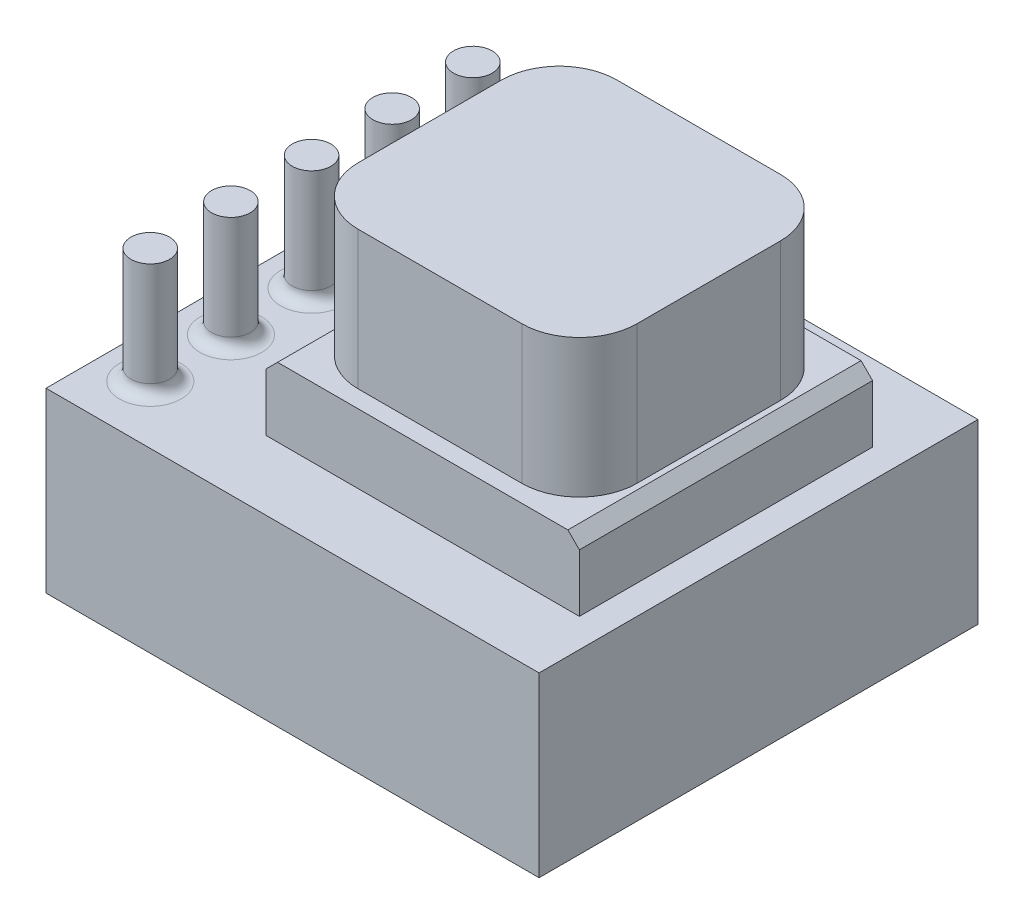
ISO-10303-21;
HEADER;
FILE_DESCRIPTION(('STEP AP214'),'2;1');
FILE_NAME('part.step','',(''),(''),'','','');
FILE_SCHEMA(('AUTOMOTIVE_DESIGN { 1 0 10303 214 1 1 1 1 }'));
ENDSEC;
DATA;
#1=APPLICATION_CONTEXT('core data for automotive mechanical design processes');
#2=APPLICATION_PROTOCOL_DEFINITION('international standard','automotive_design',2000,#1);
#3=PRODUCT_CONTEXT('',#1,'mechanical');
#4=PRODUCT('Part','Part','',(#3));
#5=PRODUCT_RELATED_PRODUCT_CATEGORY('part','',(#4));
#6=PRODUCT_DEFINITION_FORMATION('','',#4);
#7=PRODUCT_DEFINITION_CONTEXT('part definition',#1,'design');
#8=PRODUCT_DEFINITION('design','',#6,#7);
#9=PRODUCT_DEFINITION_SHAPE('','',#8);
#10=(LENGTH_UNIT() NAMED_UNIT(*) SI_UNIT(.MILLI.,.METRE.));
#11=(NAMED_UNIT(*) PLANE_ANGLE_UNIT() SI_UNIT($,.RADIAN.));
#12=(NAMED_UNIT(*) SI_UNIT($,.STERADIAN.) SOLID_ANGLE_UNIT());
#13=UNCERTAINTY_MEASURE_WITH_UNIT(LENGTH_MEASURE(1.E-05),#10,'distance_accuracy_value','');
#14=(GEOMETRIC_REPRESENTATION_CONTEXT(3) GLOBAL_UNCERTAINTY_ASSIGNED_CONTEXT((#13)) GLOBAL_UNIT_ASSIGNED_CONTEXT((#10,
#11,#12)) REPRESENTATION_CONTEXT('',''));
#15=CARTESIAN_POINT('',(0.,0.,0.));
#16=DIRECTION('',(0.,0.,1.));
#17=DIRECTION('',(1.,0.,0.));
#18=AXIS2_PLACEMENT_3D('',#15,#16,#17);
#19=CARTESIAN_POINT('',(0.,33.4,0.));
#20=DIRECTION('',(0.,-1.,0.));
#21=DIRECTION('',(0.,0.,-1.));
#22=AXIS2_PLACEMENT_3D('',#19,#20,#21);
#23=PLANE('',#22);
#24=CARTESIAN_POINT('',(19.6,33.4,-24.95));
#25=DIRECTION('',(0.,1.,0.));
#26=DIRECTION('',(0.,0.,1.));
#27=AXIS2_PLACEMENT_3D('',#24,#25,#26);
#28=CIRCLE('',#27,5.);
#29=CARTESIAN_POINT('',(14.6,33.4,-24.95));
#30=VERTEX_POINT('',#29);
#31=CARTESIAN_POINT('',(19.6,33.4,-29.95));
#32=VERTEX_POINT('',#31);
#33=EDGE_CURVE('E177',#30,#32,#28,.F.);
#34=ORIENTED_EDGE('',*,*,#33,.F.);
#35=DIRECTION('',(0.,0.,1.));
#36=VECTOR('',#35,1.);
#37=CARTESIAN_POINT('',(14.6,33.4,-29.95));
#38=LINE('',#37,#36);
#39=CARTESIAN_POINT('',(14.6,33.4,-12.5));
#40=VERTEX_POINT('',#39);
#41=EDGE_CURVE('E172',#40,#30,#38,.F.);
#42=ORIENTED_EDGE('',*,*,#41,.F.);
#43=CARTESIAN_POINT('',(19.6,33.4,-12.5));
#44=DIRECTION('',(0.,1.,0.));
#45=DIRECTION('',(0.,0.,1.));
#46=AXIS2_PLACEMENT_3D('',#43,#44,#45);
#47=CIRCLE('',#46,5.);
#48=CARTESIAN_POINT('',(19.6,33.4,-7.5));
#49=VERTEX_POINT('',#48);
#50=EDGE_CURVE('E245',#49,#40,#47,.F.);
#51=ORIENTED_EDGE('',*,*,#50,.F.);
#52=DIRECTION('',(1.,0.,0.));
#53=VECTOR('',#52,1.);
#54=CARTESIAN_POINT('',(14.6,33.4,-7.5));
#55=LINE('',#54,#53);
#56=CARTESIAN_POINT('',(33.8,33.4,-7.5));
#57=VERTEX_POINT('',#56);
#58=EDGE_CURVE('E205',#57,#49,#55,.F.);
#59=ORIENTED_EDGE('',*,*,#58,.F.);
#60=CARTESIAN_POINT('',(33.8,33.4,-12.5));
#61=DIRECTION('',(0.,1.,0.));
#62=DIRECTION('',(0.,0.,1.));
#63=AXIS2_PLACEMENT_3D('',#60,#61,#62);
#64=CIRCLE('',#63,5.);
#65=CARTESIAN_POINT('',(38.8,33.4,-12.5));
#66=VERTEX_POINT('',#65);
#67=EDGE_CURVE('E248',#66,#57,#64,.F.);
#68=ORIENTED_EDGE('',*,*,#67,.F.);
#69=DIRECTION('',(0.,0.,-1.));
#70=VECTOR('',#69,1.);
#71=CARTESIAN_POINT('',(38.8,33.4,-7.5));
#72=LINE('',#71,#70);
#73=CARTESIAN_POINT('',(38.8,33.4,-24.95));
#74=VERTEX_POINT('',#73);
#75=EDGE_CURVE('E209',#74,#66,#72,.F.);
#76=ORIENTED_EDGE('',*,*,#75,.F.);
#77=CARTESIAN_POINT('',(33.8,33.4,-24.95));
#78=DIRECTION('',(0.,1.,0.));
#79=DIRECTION('',(0.,0.,1.));
#80=AXIS2_PLACEMENT_3D('',#77,#78,#79);
#81=CIRCLE('',#80,5.);
#82=CARTESIAN_POINT('',(33.8,33.4,-29.95));
#83=VERTEX_POINT('',#82);
#84=EDGE_CURVE('E190',#83,#74,#81,.F.);
#85=ORIENTED_EDGE('',*,*,#84,.F.);
#86=DIRECTION('',(-1.,0.,0.));
#87=VECTOR('',#86,1.);
#88=CARTESIAN_POINT('',(38.8,33.4,-29.95));
#89=LINE('',#88,#87);
#90=EDGE_CURVE('E188',#32,#83,#89,.F.);
#91=ORIENTED_EDGE('',*,*,#90,.F.);
#92=EDGE_LOOP('',(#34,#42,#51,#59,#68,#76,#85,#91));
#93=FACE_BOUND('',#92,.T.);
#94=ADVANCED_FACE('F18',(#93),#23,.F.);
#95=CARTESIAN_POINT('',(4.,25.4,-5.05));
#96=DIRECTION('',(0.,1.,0.));
#97=DIRECTION('',(0.,0.,1.));
#98=AXIS2_PLACEMENT_3D('',#95,#96,#97);
#99=PLANE('',#98);
#100=CARTESIAN_POINT('',(4.,25.4,-5.05));
#101=DIRECTION('',(0.,-1.,0.));
#102=DIRECTION('',(0.,0.,-1.));
#103=AXIS2_PLACEMENT_3D('',#100,#101,#102);
#104=CIRCLE('',#103,1.675);
#105=CARTESIAN_POINT('',(4.,25.4,-6.725));
#106=VERTEX_POINT('',#105);
#107=EDGE_CURVE('E241',#106,#106,#104,.T.);
#108=ORIENTED_EDGE('',*,*,#107,.F.);
#109=EDGE_LOOP('',(#108));
#110=FACE_BOUND('',#109,.T.);
#111=ADVANCED_FACE('F829',(#110),#99,.T.);
#112=CARTESIAN_POINT('',(4.,25.4,-12.05));
#113=DIRECTION('',(0.,1.,0.));
#114=DIRECTION('',(0.,0.,1.));
#115=AXIS2_PLACEMENT_3D('',#112,#113,#114);
#116=PLANE('',#115);
#117=CARTESIAN_POINT('',(4.,25.4,-12.05));
#118=DIRECTION('',(0.,-1.,0.));
#119=DIRECTION('',(0.,0.,-1.));
#120=AXIS2_PLACEMENT_3D('',#117,#118,#119);
#121=CIRCLE('',#120,1.675);
#122=CARTESIAN_POINT('',(4.,25.4,-13.725));
#123=VERTEX_POINT('',#122);
#124=EDGE_CURVE('E238',#123,#123,#121,.T.);
#125=ORIENTED_EDGE('',*,*,#124,.F.);
#126=EDGE_LOOP('',(#125));
#127=FACE_BOUND('',#126,.T.);
#128=ADVANCED_FACE('F594',(#127),#116,.T.);
#129=CARTESIAN_POINT('',(4.,25.4,-19.05));
#130=DIRECTION('',(0.,1.,0.));
#131=DIRECTION('',(0.,0.,1.));
#132=AXIS2_PLACEMENT_3D('',#129,#130,#131);
#133=PLANE('',#132);
#134=CARTESIAN_POINT('',(4.,25.4,-19.05));
#135=DIRECTION('',(0.,-1.,0.));
#136=DIRECTION('',(0.,0.,-1.));
#137=AXIS2_PLACEMENT_3D('',#134,#135,#136);
#138=CIRCLE('',#137,1.675);
#139=CARTESIAN_POINT('',(4.,25.4,-20.725));
#140=VERTEX_POINT('',#139);
#141=EDGE_CURVE('E235',#140,#140,#138,.T.);
#142=ORIENTED_EDGE('',*,*,#141,.F.);
#143=EDGE_LOOP('',(#142));
#144=FACE_BOUND('',#143,.T.);
#145=ADVANCED_FACE('F584',(#144),#133,.T.);
#146=CARTESIAN_POINT('',(4.,25.4,-26.05));
#147=DIRECTION('',(0.,1.,0.));
#148=DIRECTION('',(0.,0.,1.));
#149=AXIS2_PLACEMENT_3D('',#146,#147,#148);
#150=PLANE('',#149);
#151=CARTESIAN_POINT('',(4.,25.4,-26.05));
#152=DIRECTION('',(0.,-1.,0.));
#153=DIRECTION('',(0.,0.,-1.));
#154=AXIS2_PLACEMENT_3D('',#151,#152,#153);
#155=CIRCLE('',#154,1.675);
#156=CARTESIAN_POINT('',(4.,25.4,-27.725));
#157=VERTEX_POINT('',#156);
#158=EDGE_CURVE('E232',#157,#157,#155,.T.);
#159=ORIENTED_EDGE('',*,*,#158,.F.);
#160=EDGE_LOOP('',(#159));
#161=FACE_BOUND('',#160,.T.);
#162=ADVANCED_FACE('F581',(#161),#150,.T.);
#163=CARTESIAN_POINT('',(4.,25.4,-33.05));
#164=DIRECTION('',(0.,1.,0.));
#165=DIRECTION('',(0.,0.,1.));
#166=AXIS2_PLACEMENT_3D('',#163,#164,#165);
#167=PLANE('',#166);
#168=CARTESIAN_POINT('',(4.,25.4,-33.05));
#169=DIRECTION('',(0.,-1.,0.));
#170=DIRECTION('',(0.,0.,-1.));
#171=AXIS2_PLACEMENT_3D('',#168,#169,#170);
#172=CIRCLE('',#171,1.675);
#173=CARTESIAN_POINT('',(4.,25.4,-34.725));
#174=VERTEX_POINT('',#173);
#175=EDGE_CURVE('E228',#174,#174,#172,.T.);
#176=ORIENTED_EDGE('',*,*,#175,.F.);
#177=EDGE_LOOP('',(#176));
#178=FACE_BOUND('',#177,.T.);
#179=ADVANCED_FACE('F583',(#178),#167,.T.);
#180=CARTESIAN_POINT('',(14.6,21.4,-29.95));
#181=DIRECTION('',(-1.,0.,0.));
#182=DIRECTION('',(0.,0.,1.));
#183=AXIS2_PLACEMENT_3D('',#180,#181,#182);
#184=PLANE('',#183);
#185=DIRECTION('',(0.,0.,1.));
#186=VECTOR('',#185,1.);
#187=CARTESIAN_POINT('',(14.6,21.4,-19.05));
#188=LINE('',#187,#186);
#189=CARTESIAN_POINT('',(14.6,21.4,-12.5));
#190=VERTEX_POINT('',#189);
#191=CARTESIAN_POINT('',(14.6,21.4,-24.95));
#192=VERTEX_POINT('',#191);
#193=EDGE_CURVE('E227',#190,#192,#188,.F.);
#194=ORIENTED_EDGE('',*,*,#193,.F.);
#195=DIRECTION('',(0.,1.,0.));
#196=VECTOR('',#195,1.);
#197=CARTESIAN_POINT('',(14.6,21.4,-12.5));
#198=LINE('',#197,#196);
#199=EDGE_CURVE('E244',#40,#190,#198,.F.);
#200=ORIENTED_EDGE('',*,*,#199,.F.);
#201=ORIENTED_EDGE('',*,*,#41,.T.);
#202=DIRECTION('',(0.,1.,0.));
#203=VECTOR('',#202,1.);
#204=CARTESIAN_POINT('',(14.6,21.4,-24.95));
#205=LINE('',#204,#203);
#206=EDGE_CURVE('E184',#192,#30,#205,.T.);
#207=ORIENTED_EDGE('',*,*,#206,.F.);
#208=EDGE_LOOP('',(#194,#200,#201,#207));
#209=FACE_BOUND('',#208,.T.);
#210=ADVANCED_FACE('F591',(#209),#184,.T.);
#211=CARTESIAN_POINT('',(19.6,21.4,-24.95));
#212=DIRECTION('',(0.,1.,0.));
#213=DIRECTION('',(0.,0.,1.));
#214=AXIS2_PLACEMENT_3D('',#211,#212,#213);
#215=CYLINDRICAL_SURFACE('',#214,5.);
#216=ORIENTED_EDGE('',*,*,#33,.T.);
#217=DIRECTION('',(0.,1.,0.));
#218=VECTOR('',#217,1.);
#219=CARTESIAN_POINT('',(19.6,21.4,-29.95));
#220=LINE('',#219,#218);
#221=CARTESIAN_POINT('',(19.6,21.4,-29.95));
#222=VERTEX_POINT('',#221);
#223=EDGE_CURVE('E182',#222,#32,#220,.T.);
#224=ORIENTED_EDGE('',*,*,#223,.F.);
#225=CARTESIAN_POINT('',(19.6,21.4,-24.95));
#226=DIRECTION('',(0.,1.,0.));
#227=DIRECTION('',(0.,0.,1.));
#228=AXIS2_PLACEMENT_3D('',#225,#226,#227);
#229=CIRCLE('',#228,5.);
#230=EDGE_CURVE('E225',#192,#222,#229,.F.);
#231=ORIENTED_EDGE('',*,*,#230,.F.);
#232=ORIENTED_EDGE('',*,*,#206,.T.);
#233=EDGE_LOOP('',(#216,#224,#231,#232));
#234=FACE_BOUND('',#233,.T.);
#235=ADVANCED_FACE('F179',(#234),#215,.T.);
#236=CARTESIAN_POINT('',(38.8,21.4,-29.95));
#237=DIRECTION('',(0.,0.,-1.));
#238=DIRECTION('',(-1.,0.,0.));
#239=AXIS2_PLACEMENT_3D('',#236,#237,#238);
#240=PLANE('',#239);
#241=ORIENTED_EDGE('',*,*,#90,.T.);
#242=DIRECTION('',(0.,1.,0.));
#243=VECTOR('',#242,1.);
#244=CARTESIAN_POINT('',(33.8,21.4,-29.95));
#245=LINE('',#244,#243);
#246=CARTESIAN_POINT('',(33.8,21.4,-29.95));
#247=VERTEX_POINT('',#246);
#248=EDGE_CURVE('E193',#247,#83,#245,.T.);
#249=ORIENTED_EDGE('',*,*,#248,.F.);
#250=DIRECTION('',(1.,0.,0.));
#251=VECTOR('',#250,1.);
#252=CARTESIAN_POINT('',(21.4,21.4,-29.95));
#253=LINE('',#252,#251);
#254=EDGE_CURVE('E197',#222,#247,#253,.T.);
#255=ORIENTED_EDGE('',*,*,#254,.F.);
#256=ORIENTED_EDGE('',*,*,#223,.T.);
#257=EDGE_LOOP('',(#241,#249,#255,#256));
#258=FACE_BOUND('',#257,.T.);
#259=ADVANCED_FACE('F195',(#258),#240,.T.);
#260=CARTESIAN_POINT('',(33.8,21.4,-24.95));
#261=DIRECTION('',(0.,1.,0.));
#262=DIRECTION('',(0.,0.,1.));
#263=AXIS2_PLACEMENT_3D('',#260,#261,#262);
#264=CYLINDRICAL_SURFACE('',#263,5.);
#265=ORIENTED_EDGE('',*,*,#84,.T.);
#266=DIRECTION('',(0.,1.,0.));
#267=VECTOR('',#266,1.);
#268=CARTESIAN_POINT('',(38.8,21.4,-24.95));
#269=LINE('',#268,#267);
#270=CARTESIAN_POINT('',(38.8,21.4,-24.95));
#271=VERTEX_POINT('',#270);
#272=EDGE_CURVE('E211',#271,#74,#269,.T.);
#273=ORIENTED_EDGE('',*,*,#272,.F.);
#274=CARTESIAN_POINT('',(33.8,21.4,-24.95));
#275=DIRECTION('',(0.,1.,0.));
#276=DIRECTION('',(0.,0.,1.));
#277=AXIS2_PLACEMENT_3D('',#274,#275,#276);
#278=CIRCLE('',#277,5.);
#279=EDGE_CURVE('E222',#247,#271,#278,.F.);
#280=ORIENTED_EDGE('',*,*,#279,.F.);
#281=ORIENTED_EDGE('',*,*,#248,.T.);
#282=EDGE_LOOP('',(#265,#273,#280,#281));
#283=FACE_BOUND('',#282,.T.);
#284=ADVANCED_FACE('F507',(#283),#264,.T.);
#285=CARTESIAN_POINT('',(38.8,21.4,-7.5));
#286=DIRECTION('',(1.,0.,0.));
#287=DIRECTION('',(0.,0.,-1.));
#288=AXIS2_PLACEMENT_3D('',#285,#286,#287);
#289=PLANE('',#288);
#290=ORIENTED_EDGE('',*,*,#75,.T.);
#291=DIRECTION('',(0.,1.,0.));
#292=VECTOR('',#291,1.);
#293=CARTESIAN_POINT('',(38.8,21.4,-12.5));
#294=LINE('',#293,#292);
#295=CARTESIAN_POINT('',(38.8,21.4,-12.5));
#296=VERTEX_POINT('',#295);
#297=EDGE_CURVE('E210',#296,#66,#294,.T.);
#298=ORIENTED_EDGE('',*,*,#297,.F.);
#299=DIRECTION('',(0.,0.,1.));
#300=VECTOR('',#299,1.);
#301=CARTESIAN_POINT('',(38.8,21.4,-19.05));
#302=LINE('',#301,#300);
#303=EDGE_CURVE('E221',#271,#296,#302,.T.);
#304=ORIENTED_EDGE('',*,*,#303,.F.);
#305=ORIENTED_EDGE('',*,*,#272,.T.);
#306=EDGE_LOOP('',(#290,#298,#304,#305));
#307=FACE_BOUND('',#306,.T.);
#308=ADVANCED_FACE('F502',(#307),#289,.T.);
#309=CARTESIAN_POINT('',(33.8,21.4,-12.5));
#310=DIRECTION('',(0.,1.,0.));
#311=DIRECTION('',(0.,0.,1.));
#312=AXIS2_PLACEMENT_3D('',#309,#310,#311);
#313=CYLINDRICAL_SURFACE('',#312,5.);
#314=ORIENTED_EDGE('',*,*,#67,.T.);
#315=DIRECTION('',(0.,1.,0.));
#316=VECTOR('',#315,1.);
#317=CARTESIAN_POINT('',(33.8,21.4,-7.5));
#318=LINE('',#317,#316);
#319=CARTESIAN_POINT('',(33.8,21.4,-7.5));
#320=VERTEX_POINT('',#319);
#321=EDGE_CURVE('E208',#320,#57,#318,.T.);
#322=ORIENTED_EDGE('',*,*,#321,.F.);
#323=CARTESIAN_POINT('',(33.8,21.4,-12.5));
#324=DIRECTION('',(0.,1.,0.));
#325=DIRECTION('',(0.,0.,1.));
#326=AXIS2_PLACEMENT_3D('',#323,#324,#325);
#327=CIRCLE('',#326,5.);
#328=EDGE_CURVE('E218',#296,#320,#327,.F.);
#329=ORIENTED_EDGE('',*,*,#328,.F.);
#330=ORIENTED_EDGE('',*,*,#297,.T.);
#331=EDGE_LOOP('',(#314,#322,#329,#330));
#332=FACE_BOUND('',#331,.T.);
#333=ADVANCED_FACE('F512',(#332),#313,.T.);
#334=CARTESIAN_POINT('',(14.6,21.4,-7.5));
#335=DIRECTION('',(0.,0.,1.));
#336=DIRECTION('',(1.,0.,0.));
#337=AXIS2_PLACEMENT_3D('',#334,#335,#336);
#338=PLANE('',#337);
#339=ORIENTED_EDGE('',*,*,#58,.T.);
#340=DIRECTION('',(0.,1.,0.));
#341=VECTOR('',#340,1.);
#342=CARTESIAN_POINT('',(19.6,21.4,-7.5));
#343=LINE('',#342,#341);
#344=CARTESIAN_POINT('',(19.6,21.4,-7.5));
#345=VERTEX_POINT('',#344);
#346=EDGE_CURVE('E207',#345,#49,#343,.T.);
#347=ORIENTED_EDGE('',*,*,#346,.F.);
#348=DIRECTION('',(1.,0.,0.));
#349=VECTOR('',#348,1.);
#350=CARTESIAN_POINT('',(21.4,21.4,-7.5));
#351=LINE('',#350,#349);
#352=EDGE_CURVE('E217',#320,#345,#351,.F.);
#353=ORIENTED_EDGE('',*,*,#352,.F.);
#354=ORIENTED_EDGE('',*,*,#321,.T.);
#355=EDGE_LOOP('',(#339,#347,#353,#354));
#356=FACE_BOUND('',#355,.T.);
#357=ADVANCED_FACE('F757',(#356),#338,.T.);
#358=CARTESIAN_POINT('',(19.6,21.4,-12.5));
#359=DIRECTION('',(0.,1.,0.));
#360=DIRECTION('',(0.,0.,1.));
#361=AXIS2_PLACEMENT_3D('',#358,#359,#360);
#362=CYLINDRICAL_SURFACE('',#361,5.);
#363=ORIENTED_EDGE('',*,*,#50,.T.);
#364=ORIENTED_EDGE('',*,*,#199,.T.);
#365=CARTESIAN_POINT('',(19.6,21.4,-12.5));
#366=DIRECTION('',(0.,1.,0.));
#367=DIRECTION('',(0.,0.,1.));
#368=AXIS2_PLACEMENT_3D('',#365,#366,#367);
#369=CIRCLE('',#368,5.);
#370=EDGE_CURVE('E213',#345,#190,#369,.F.);
#371=ORIENTED_EDGE('',*,*,#370,.F.);
#372=ORIENTED_EDGE('',*,*,#346,.T.);
#373=EDGE_LOOP('',(#363,#364,#371,#372));
#374=FACE_BOUND('',#373,.T.);
#375=ADVANCED_FACE('F749',(#374),#362,.T.);
#376=CARTESIAN_POINT('',(4.,25.4,-5.05));
#377=DIRECTION('',(0.,-1.,0.));
#378=DIRECTION('',(0.,0.,-1.));
#379=AXIS2_PLACEMENT_3D('',#376,#377,#378);
#380=CYLINDRICAL_SURFACE('',#379,1.675);
#381=CARTESIAN_POINT('',(4.,16.4,-5.05));
#382=DIRECTION('',(0.,-1.,0.));
#383=DIRECTION('',(0.,0.,-1.));
#384=AXIS2_PLACEMENT_3D('',#381,#382,#383);
#385=CIRCLE('',#384,1.675);
#386=CARTESIAN_POINT('',(4.,16.4,-6.725));
#387=VERTEX_POINT('',#386);
#388=EDGE_CURVE('E488',#387,#387,#385,.F.);
#389=ORIENTED_EDGE('',*,*,#388,.T.);
#390=EDGE_LOOP('',(#389));
#391=FACE_BOUND('',#390,.T.);
#392=ORIENTED_EDGE('',*,*,#107,.T.);
#393=EDGE_LOOP('',(#392));
#394=FACE_BOUND('',#393,.T.);
#395=ADVANCED_FACE('F741',(#391,#394),#380,.T.);
#396=CARTESIAN_POINT('',(4.,25.4,-12.05));
#397=DIRECTION('',(0.,-1.,0.));
#398=DIRECTION('',(0.,0.,-1.));
#399=AXIS2_PLACEMENT_3D('',#396,#397,#398);
#400=CYLINDRICAL_SURFACE('',#399,1.675);
#401=CARTESIAN_POINT('',(4.,16.4,-12.05));
#402=DIRECTION('',(0.,-1.,0.));
#403=DIRECTION('',(0.,0.,-1.));
#404=AXIS2_PLACEMENT_3D('',#401,#402,#403);
#405=CIRCLE('',#404,1.675);
#406=CARTESIAN_POINT('',(4.,16.4,-13.725));
#407=VERTEX_POINT('',#406);
#408=EDGE_CURVE('E485',#407,#407,#405,.F.);
#409=ORIENTED_EDGE('',*,*,#408,.T.);
#410=EDGE_LOOP('',(#409));
#411=FACE_BOUND('',#410,.T.);
#412=ORIENTED_EDGE('',*,*,#124,.T.);
#413=EDGE_LOOP('',(#412));
#414=FACE_BOUND('',#413,.T.);
#415=ADVANCED_FACE('F733',(#411,#414),#400,.T.);
#416=CARTESIAN_POINT('',(4.,25.4,-19.05));
#417=DIRECTION('',(0.,-1.,0.));
#418=DIRECTION('',(0.,0.,-1.));
#419=AXIS2_PLACEMENT_3D('',#416,#417,#418);
#420=CYLINDRICAL_SURFACE('',#419,1.675);
#421=CARTESIAN_POINT('',(4.,16.4,-19.05));
#422=DIRECTION('',(0.,-1.,0.));
#423=DIRECTION('',(0.,0.,-1.));
#424=AXIS2_PLACEMENT_3D('',#421,#422,#423);
#425=CIRCLE('',#424,1.675);
#426=CARTESIAN_POINT('',(4.,16.4,-20.725));
#427=VERTEX_POINT('',#426);
#428=EDGE_CURVE('E478',#427,#427,#425,.F.);
#429=ORIENTED_EDGE('',*,*,#428,.T.);
#430=EDGE_LOOP('',(#429));
#431=FACE_BOUND('',#430,.T.);
#432=ORIENTED_EDGE('',*,*,#141,.T.);
#433=EDGE_LOOP('',(#432));
#434=FACE_BOUND('',#433,.T.);
#435=ADVANCED_FACE('F577',(#431,#434),#420,.T.);
#436=CARTESIAN_POINT('',(4.,25.4,-26.05));
#437=DIRECTION('',(0.,-1.,0.));
#438=DIRECTION('',(0.,0.,-1.));
#439=AXIS2_PLACEMENT_3D('',#436,#437,#438);
#440=CYLINDRICAL_SURFACE('',#439,1.675);
#441=CARTESIAN_POINT('',(4.,16.4,-26.05));
#442=DIRECTION('',(0.,-1.,0.));
#443=DIRECTION('',(0.,0.,-1.));
#444=AXIS2_PLACEMENT_3D('',#441,#442,#443);
#445=CIRCLE('',#444,1.675);
#446=CARTESIAN_POINT('',(4.,16.4,-27.725));
#447=VERTEX_POINT('',#446);
#448=EDGE_CURVE('E473',#447,#447,#445,.F.);
#449=ORIENTED_EDGE('',*,*,#448,.T.);
#450=EDGE_LOOP('',(#449));
#451=FACE_BOUND('',#450,.T.);
#452=ORIENTED_EDGE('',*,*,#158,.T.);
#453=EDGE_LOOP('',(#452));
#454=FACE_BOUND('',#453,.T.);
#455=ADVANCED_FACE('F573',(#451,#454),#440,.T.);
#456=CARTESIAN_POINT('',(4.,25.4,-33.05));
#457=DIRECTION('',(0.,-1.,0.));
#458=DIRECTION('',(0.,0.,-1.));
#459=AXIS2_PLACEMENT_3D('',#456,#457,#458);
#460=CYLINDRICAL_SURFACE('',#459,1.675);
#461=CARTESIAN_POINT('',(4.,16.4,-33.05));
#462=DIRECTION('',(0.,-1.,0.));
#463=DIRECTION('',(0.,0.,-1.));
#464=AXIS2_PLACEMENT_3D('',#461,#462,#463);
#465=CIRCLE('',#464,1.675);
#466=CARTESIAN_POINT('',(4.,16.4,-34.725));
#467=VERTEX_POINT('',#466);
#468=EDGE_CURVE('E469',#467,#467,#465,.F.);
#469=ORIENTED_EDGE('',*,*,#468,.T.);
#470=EDGE_LOOP('',(#469));
#471=FACE_BOUND('',#470,.T.);
#472=ORIENTED_EDGE('',*,*,#175,.T.);
#473=EDGE_LOOP('',(#472));
#474=FACE_BOUND('',#473,.T.);
#475=ADVANCED_FACE('F576',(#471,#474),#460,.T.);
#476=CARTESIAN_POINT('',(14.1,21.4,-19.05));
#477=DIRECTION('',(-0.707106781186548,0.707106781186547,0.));
#478=DIRECTION('',(-0.707106781186547,-0.707106781186548,0.));
#479=AXIS2_PLACEMENT_3D('',#476,#477,#478);
#480=PLANE('',#479);
#481=DIRECTION('',(-0.707106781186547,-0.707106781186548,0.));
#482=VECTOR('',#481,1.);
#483=CARTESIAN_POINT('',(14.1,21.4,-5.99999999999999));
#484=LINE('',#483,#482);
#485=CARTESIAN_POINT('',(13.1,20.4,-6.));
#486=VERTEX_POINT('',#485);
#487=CARTESIAN_POINT('',(14.1,21.4,-6.));
#488=VERTEX_POINT('',#487);
#489=EDGE_CURVE('E231',#486,#488,#484,.F.);
#490=ORIENTED_EDGE('',*,*,#489,.T.);
#491=DIRECTION('',(0.,0.,1.));
#492=VECTOR('',#491,1.);
#493=CARTESIAN_POINT('',(14.1,21.4,-19.05));
#494=LINE('',#493,#492);
#495=CARTESIAN_POINT('',(14.1,21.4,-31.45));
#496=VERTEX_POINT('',#495);
#497=EDGE_CURVE('E216',#496,#488,#494,.T.);
#498=ORIENTED_EDGE('',*,*,#497,.F.);
#499=DIRECTION('',(-0.707106781186545,-0.70710678118655,0.));
#500=VECTOR('',#499,1.);
#501=CARTESIAN_POINT('',(14.1,21.4,-31.45));
#502=LINE('',#501,#500);
#503=CARTESIAN_POINT('',(13.1,20.4,-31.45));
#504=VERTEX_POINT('',#503);
#505=EDGE_CURVE('E461',#496,#504,#502,.T.);
#506=ORIENTED_EDGE('',*,*,#505,.T.);
#507=DIRECTION('',(0.,0.,-1.));
#508=VECTOR('',#507,1.);
#509=CARTESIAN_POINT('',(13.1,20.4,-31.45));
#510=LINE('',#509,#508);
#511=EDGE_CURVE('E455',#504,#486,#510,.F.);
#512=ORIENTED_EDGE('',*,*,#511,.T.);
#513=EDGE_LOOP('',(#490,#498,#506,#512));
#514=FACE_BOUND('',#513,.T.);
#515=ADVANCED_FACE('F523',(#514),#480,.T.);
#516=CARTESIAN_POINT('',(21.4,21.4,-19.05));
#517=DIRECTION('',(0.,1.,0.));
#518=DIRECTION('',(0.,0.,1.));
#519=AXIS2_PLACEMENT_3D('',#516,#517,#518);
#520=PLANE('',#519);
#521=DIRECTION('',(-1.,0.,0.));
#522=VECTOR('',#521,1.);
#523=CARTESIAN_POINT('',(40.3,21.4,-6.));
#524=LINE('',#523,#522);
#525=CARTESIAN_POINT('',(39.3,21.4,-5.99999999999999));
#526=VERTEX_POINT('',#525);
#527=EDGE_CURVE('E447',#488,#526,#524,.F.);
#528=ORIENTED_EDGE('',*,*,#527,.T.);
#529=DIRECTION('',(0.,0.,1.));
#530=VECTOR('',#529,1.);
#531=CARTESIAN_POINT('',(39.3,21.4,-19.05));
#532=LINE('',#531,#530);
#533=CARTESIAN_POINT('',(39.3,21.4,-31.45));
#534=VERTEX_POINT('',#533);
#535=EDGE_CURVE('E491',#534,#526,#532,.T.);
#536=ORIENTED_EDGE('',*,*,#535,.F.);
#537=DIRECTION('',(1.,0.,0.));
#538=VECTOR('',#537,1.);
#539=CARTESIAN_POINT('',(40.3,21.4,-31.45));
#540=LINE('',#539,#538);
#541=EDGE_CURVE('E462',#534,#496,#540,.F.);
#542=ORIENTED_EDGE('',*,*,#541,.T.);
#543=ORIENTED_EDGE('',*,*,#497,.T.);
#544=EDGE_LOOP('',(#528,#536,#542,#543));
#545=FACE_BOUND('',#544,.T.);
#546=ORIENTED_EDGE('',*,*,#352,.T.);
#547=ORIENTED_EDGE('',*,*,#370,.T.);
#548=ORIENTED_EDGE('',*,*,#193,.T.);
#549=ORIENTED_EDGE('',*,*,#230,.T.);
#550=ORIENTED_EDGE('',*,*,#254,.T.);
#551=ORIENTED_EDGE('',*,*,#279,.T.);
#552=ORIENTED_EDGE('',*,*,#303,.T.);
#553=ORIENTED_EDGE('',*,*,#328,.T.);
#554=EDGE_LOOP('',(#546,#547,#548,#549,#550,#551,#552,#553));
#555=FACE_BOUND('',#554,.T.);
#556=ADVANCED_FACE('F516',(#545,#555),#520,.T.);
#557=CARTESIAN_POINT('',(39.3,21.4,-19.05));
#558=DIRECTION('',(0.70710678118655,0.707106781186545,0.));
#559=DIRECTION('',(-0.707106781186545,0.70710678118655,0.));
#560=AXIS2_PLACEMENT_3D('',#557,#558,#559);
#561=PLANE('',#560);
#562=DIRECTION('',(-0.707106781186545,0.70710678118655,0.));
#563=VECTOR('',#562,1.);
#564=CARTESIAN_POINT('',(40.3,20.4,-31.45));
#565=LINE('',#564,#563);
#566=CARTESIAN_POINT('',(40.3,20.4,-31.45));
#567=VERTEX_POINT('',#566);
#568=EDGE_CURVE('E283',#567,#534,#565,.T.);
#569=ORIENTED_EDGE('',*,*,#568,.T.);
#570=ORIENTED_EDGE('',*,*,#535,.T.);
#571=DIRECTION('',(0.707106781186545,-0.70710678118655,0.));
#572=VECTOR('',#571,1.);
#573=CARTESIAN_POINT('',(39.3,21.4,-6.));
#574=LINE('',#573,#572);
#575=CARTESIAN_POINT('',(40.3,20.4,-6.));
#576=VERTEX_POINT('',#575);
#577=EDGE_CURVE('E453',#526,#576,#574,.T.);
#578=ORIENTED_EDGE('',*,*,#577,.T.);
#579=DIRECTION('',(0.,0.,1.));
#580=VECTOR('',#579,1.);
#581=CARTESIAN_POINT('',(40.3,20.4,-31.45));
#582=LINE('',#581,#580);
#583=EDGE_CURVE('E442',#576,#567,#582,.F.);
#584=ORIENTED_EDGE('',*,*,#583,.T.);
#585=EDGE_LOOP('',(#569,#570,#578,#584));
#586=FACE_BOUND('',#585,.T.);
#587=ADVANCED_FACE('F532',(#586),#561,.T.);
#588=CARTESIAN_POINT('',(4.,16.4,-5.05));
#589=DIRECTION('',(0.,-1.,0.));
#590=DIRECTION('',(0.,0.,-1.));
#591=AXIS2_PLACEMENT_3D('',#588,#589,#590);
#592=TOROIDAL_SURFACE('',#591,2.675,1.);
#593=CARTESIAN_POINT('',(4.,15.4,-5.05));
#594=DIRECTION('',(0.,1.,0.));
#595=DIRECTION('',(0.,0.,1.));
#596=AXIS2_PLACEMENT_3D('',#593,#594,#595);
#597=CIRCLE('',#596,2.675);
#598=CARTESIAN_POINT('',(4.,15.4,-2.375));
#599=VERTEX_POINT('',#598);
#600=CARTESIAN_POINT('',(4.,15.4,-7.725));
#601=VERTEX_POINT('',#600);
#602=EDGE_CURVE('E350',#599,#601,#597,.T.);
#603=ORIENTED_EDGE('',*,*,#602,.T.);
#604=CARTESIAN_POINT('',(4.,15.4,-5.05));
#605=DIRECTION('',(0.,1.,0.));
#606=DIRECTION('',(0.,0.,-1.));
#607=AXIS2_PLACEMENT_3D('',#604,#605,#606);
#608=CIRCLE('',#607,2.675);
#609=EDGE_CURVE('E346',#601,#599,#608,.T.);
#610=ORIENTED_EDGE('',*,*,#609,.T.);
#611=EDGE_LOOP('',(#603,#610));
#612=FACE_BOUND('',#611,.T.);
#613=ORIENTED_EDGE('',*,*,#388,.F.);
#614=EDGE_LOOP('',(#613));
#615=FACE_BOUND('',#614,.T.);
#616=ADVANCED_FACE('F348',(#612,#615),#592,.F.);
#617=CARTESIAN_POINT('',(4.,16.4,-12.05));
#618=DIRECTION('',(0.,-1.,0.));
#619=DIRECTION('',(0.,0.,-1.));
#620=AXIS2_PLACEMENT_3D('',#617,#618,#619);
#621=TOROIDAL_SURFACE('',#620,2.675,1.);
#622=CARTESIAN_POINT('',(4.,15.4,-12.05));
#623=DIRECTION('',(0.,1.,0.));
#624=DIRECTION('',(0.,0.,1.));
#625=AXIS2_PLACEMENT_3D('',#622,#623,#624);
#626=CIRCLE('',#625,2.675);
#627=CARTESIAN_POINT('',(4.,15.4,-9.375));
#628=VERTEX_POINT('',#627);
#629=CARTESIAN_POINT('',(4.,15.4,-14.725));
#630=VERTEX_POINT('',#629);
#631=EDGE_CURVE('E558',#628,#630,#626,.T.);
#632=ORIENTED_EDGE('',*,*,#631,.T.);
#633=CARTESIAN_POINT('',(4.,15.4,-12.05));
#634=DIRECTION('',(0.,1.,0.));
#635=DIRECTION('',(0.,0.,-1.));
#636=AXIS2_PLACEMENT_3D('',#633,#634,#635);
#637=CIRCLE('',#636,2.675);
#638=EDGE_CURVE('E335',#630,#628,#637,.T.);
#639=ORIENTED_EDGE('',*,*,#638,.T.);
#640=EDGE_LOOP('',(#632,#639));
#641=FACE_BOUND('',#640,.T.);
#642=ORIENTED_EDGE('',*,*,#408,.F.);
#643=EDGE_LOOP('',(#642));
#644=FACE_BOUND('',#643,.T.);
#645=ADVANCED_FACE('F315',(#641,#644),#621,.F.);
#646=CARTESIAN_POINT('',(4.,16.4,-19.05));
#647=DIRECTION('',(0.,-1.,0.));
#648=DIRECTION('',(0.,0.,-1.));
#649=AXIS2_PLACEMENT_3D('',#646,#647,#648);
#650=TOROIDAL_SURFACE('',#649,2.675,1.);
#651=CARTESIAN_POINT('',(4.,15.4,-19.05));
#652=DIRECTION('',(0.,1.,0.));
#653=DIRECTION('',(0.,0.,1.));
#654=AXIS2_PLACEMENT_3D('',#651,#652,#653);
#655=CIRCLE('',#654,2.675);
#656=CARTESIAN_POINT('',(4.,15.4,-16.375));
#657=VERTEX_POINT('',#656);
#658=CARTESIAN_POINT('',(4.,15.4,-21.725));
#659=VERTEX_POINT('',#658);
#660=EDGE_CURVE('E563',#657,#659,#655,.T.);
#661=ORIENTED_EDGE('',*,*,#660,.T.);
#662=CARTESIAN_POINT('',(4.,15.4,-19.05));
#663=DIRECTION('',(0.,1.,0.));
#664=DIRECTION('',(0.,0.,-1.));
#665=AXIS2_PLACEMENT_3D('',#662,#663,#664);
#666=CIRCLE('',#665,2.675);
#667=EDGE_CURVE('E562',#659,#657,#666,.T.);
#668=ORIENTED_EDGE('',*,*,#667,.T.);
#669=EDGE_LOOP('',(#661,#668));
#670=FACE_BOUND('',#669,.T.);
#671=ORIENTED_EDGE('',*,*,#428,.F.);
#672=EDGE_LOOP('',(#671));
#673=FACE_BOUND('',#672,.T.);
#674=ADVANCED_FACE('F311',(#670,#673),#650,.F.);
#675=CARTESIAN_POINT('',(4.,16.4,-26.05));
#676=DIRECTION('',(0.,-1.,0.));
#677=DIRECTION('',(0.,0.,-1.));
#678=AXIS2_PLACEMENT_3D('',#675,#676,#677);
#679=TOROIDAL_SURFACE('',#678,2.675,1.);
#680=CARTESIAN_POINT('',(4.,15.4,-26.05));
#681=DIRECTION('',(0.,1.,0.));
#682=DIRECTION('',(0.,0.,1.));
#683=AXIS2_PLACEMENT_3D('',#680,#681,#682);
#684=CIRCLE('',#683,2.675);
#685=CARTESIAN_POINT('',(4.,15.4,-23.375));
#686=VERTEX_POINT('',#685);
#687=CARTESIAN_POINT('',(4.,15.4,-28.725));
#688=VERTEX_POINT('',#687);
#689=EDGE_CURVE('E298',#686,#688,#684,.T.);
#690=ORIENTED_EDGE('',*,*,#689,.T.);
#691=CARTESIAN_POINT('',(4.,15.4,-26.05));
#692=DIRECTION('',(0.,1.,0.));
#693=DIRECTION('',(0.,0.,-1.));
#694=AXIS2_PLACEMENT_3D('',#691,#692,#693);
#695=CIRCLE('',#694,2.675);
#696=EDGE_CURVE('E566',#688,#686,#695,.T.);
#697=ORIENTED_EDGE('',*,*,#696,.T.);
#698=EDGE_LOOP('',(#690,#697));
#699=FACE_BOUND('',#698,.T.);
#700=ORIENTED_EDGE('',*,*,#448,.F.);
#701=EDGE_LOOP('',(#700));
#702=FACE_BOUND('',#701,.T.);
#703=ADVANCED_FACE('F273',(#699,#702),#679,.F.);
#704=CARTESIAN_POINT('',(4.,16.4,-33.05));
#705=DIRECTION('',(0.,-1.,0.));
#706=DIRECTION('',(0.,0.,-1.));
#707=AXIS2_PLACEMENT_3D('',#704,#705,#706);
#708=TOROIDAL_SURFACE('',#707,2.675,1.);
#709=CARTESIAN_POINT('',(4.,15.4,-33.05));
#710=DIRECTION('',(0.,1.,0.));
#711=DIRECTION('',(0.,0.,1.));
#712=AXIS2_PLACEMENT_3D('',#709,#710,#711);
#713=CIRCLE('',#712,2.675);
#714=CARTESIAN_POINT('',(4.,15.4,-30.375));
#715=VERTEX_POINT('',#714);
#716=CARTESIAN_POINT('',(4.,15.4,-35.725));
#717=VERTEX_POINT('',#716);
#718=EDGE_CURVE('E285',#715,#717,#713,.T.);
#719=ORIENTED_EDGE('',*,*,#718,.T.);
#720=CARTESIAN_POINT('',(4.,15.4,-33.05));
#721=DIRECTION('',(0.,1.,0.));
#722=DIRECTION('',(0.,0.,-1.));
#723=AXIS2_PLACEMENT_3D('',#720,#721,#722);
#724=CIRCLE('',#723,2.675);
#725=EDGE_CURVE('E254',#717,#715,#724,.T.);
#726=ORIENTED_EDGE('',*,*,#725,.T.);
#727=EDGE_LOOP('',(#719,#726));
#728=FACE_BOUND('',#727,.T.);
#729=ORIENTED_EDGE('',*,*,#468,.F.);
#730=EDGE_LOOP('',(#729));
#731=FACE_BOUND('',#730,.T.);
#732=ADVANCED_FACE('F261',(#728,#731),#708,.F.);
#733=CARTESIAN_POINT('',(40.3,33.4,-31.45));
#734=DIRECTION('',(0.,0.,1.));
#735=DIRECTION('',(1.,0.,0.));
#736=AXIS2_PLACEMENT_3D('',#733,#734,#735);
#737=PLANE('',#736);
#738=ORIENTED_EDGE('',*,*,#505,.F.);
#739=ORIENTED_EDGE('',*,*,#541,.F.);
#740=ORIENTED_EDGE('',*,*,#568,.F.);
#741=DIRECTION('',(0.,1.,0.));
#742=VECTOR('',#741,1.);
#743=CARTESIAN_POINT('',(40.3,33.4,-31.45));
#744=LINE('',#743,#742);
#745=CARTESIAN_POINT('',(40.3,15.4,-31.45));
#746=VERTEX_POINT('',#745);
#747=EDGE_CURVE('E354',#567,#746,#744,.F.);
#748=ORIENTED_EDGE('',*,*,#747,.T.);
#749=DIRECTION('',(1.,0.,0.));
#750=VECTOR('',#749,1.);
#751=CARTESIAN_POINT('',(0.,15.4,-31.45));
#752=LINE('',#751,#750);
#753=CARTESIAN_POINT('',(13.1,15.4,-31.45));
#754=VERTEX_POINT('',#753);
#755=EDGE_CURVE('E439',#746,#754,#752,.F.);
#756=ORIENTED_EDGE('',*,*,#755,.T.);
#757=DIRECTION('',(0.,1.,0.));
#758=VECTOR('',#757,1.);
#759=CARTESIAN_POINT('',(13.1,33.4,-31.45));
#760=LINE('',#759,#758);
#761=EDGE_CURVE('E458',#754,#504,#760,.T.);
#762=ORIENTED_EDGE('',*,*,#761,.T.);
#763=EDGE_LOOP('',(#738,#739,#740,#748,#756,#762));
#764=FACE_BOUND('',#763,.T.);
#765=ADVANCED_FACE('F272',(#764),#737,.F.);
#766=CARTESIAN_POINT('',(13.1,33.4,-31.45));
#767=DIRECTION('',(1.,0.,0.));
#768=DIRECTION('',(0.,0.,-1.));
#769=AXIS2_PLACEMENT_3D('',#766,#767,#768);
#770=PLANE('',#769);
#771=ORIENTED_EDGE('',*,*,#511,.F.);
#772=ORIENTED_EDGE('',*,*,#761,.F.);
#773=DIRECTION('',(0.,0.,-1.));
#774=VECTOR('',#773,1.);
#775=CARTESIAN_POINT('',(13.1,15.4,0.));
#776=LINE('',#775,#774);
#777=CARTESIAN_POINT('',(13.1,15.4,-6.));
#778=VERTEX_POINT('',#777);
#779=EDGE_CURVE('E437',#754,#778,#776,.F.);
#780=ORIENTED_EDGE('',*,*,#779,.T.);
#781=DIRECTION('',(0.,1.,0.));
#782=VECTOR('',#781,1.);
#783=CARTESIAN_POINT('',(13.1,33.4,-6.));
#784=LINE('',#783,#782);
#785=EDGE_CURVE('E450',#778,#486,#784,.T.);
#786=ORIENTED_EDGE('',*,*,#785,.T.);
#787=EDGE_LOOP('',(#771,#772,#780,#786));
#788=FACE_BOUND('',#787,.T.);
#789=ADVANCED_FACE('F668',(#788),#770,.F.);
#790=CARTESIAN_POINT('',(40.3,33.4,-6.));
#791=DIRECTION('',(0.,0.,-1.));
#792=DIRECTION('',(-1.,0.,0.));
#793=AXIS2_PLACEMENT_3D('',#790,#791,#792);
#794=PLANE('',#793);
#795=ORIENTED_EDGE('',*,*,#489,.F.);
#796=ORIENTED_EDGE('',*,*,#785,.F.);
#797=DIRECTION('',(1.,0.,0.));
#798=VECTOR('',#797,1.);
#799=CARTESIAN_POINT('',(0.,15.4,-6.));
#800=LINE('',#799,#798);
#801=CARTESIAN_POINT('',(40.3,15.4,-6.));
#802=VERTEX_POINT('',#801);
#803=EDGE_CURVE('E435',#778,#802,#800,.T.);
#804=ORIENTED_EDGE('',*,*,#803,.T.);
#805=DIRECTION('',(0.,1.,0.));
#806=VECTOR('',#805,1.);
#807=CARTESIAN_POINT('',(40.3,33.4,-6.));
#808=LINE('',#807,#806);
#809=EDGE_CURVE('E444',#802,#576,#808,.T.);
#810=ORIENTED_EDGE('',*,*,#809,.T.);
#811=ORIENTED_EDGE('',*,*,#577,.F.);
#812=ORIENTED_EDGE('',*,*,#527,.F.);
#813=EDGE_LOOP('',(#795,#796,#804,#810,#811,#812));
#814=FACE_BOUND('',#813,.T.);
#815=ADVANCED_FACE('F529',(#814),#794,.F.);
#816=CARTESIAN_POINT('',(40.3,33.4,-31.45));
#817=DIRECTION('',(-1.,0.,0.));
#818=DIRECTION('',(0.,0.,1.));
#819=AXIS2_PLACEMENT_3D('',#816,#817,#818);
#820=PLANE('',#819);
#821=ORIENTED_EDGE('',*,*,#583,.F.);
#822=ORIENTED_EDGE('',*,*,#809,.F.);
#823=DIRECTION('',(0.,0.,-1.));
#824=VECTOR('',#823,1.);
#825=CARTESIAN_POINT('',(40.3,15.4,0.));
#826=LINE('',#825,#824);
#827=EDGE_CURVE('E426',#802,#746,#826,.T.);
#828=ORIENTED_EDGE('',*,*,#827,.T.);
#829=ORIENTED_EDGE('',*,*,#747,.F.);
#830=EDGE_LOOP('',(#821,#822,#828,#829));
#831=FACE_BOUND('',#830,.T.);
#832=ADVANCED_FACE('F376',(#831),#820,.F.);
#833=CARTESIAN_POINT('',(0.,15.4,0.));
#834=DIRECTION('',(0.,-1.,0.));
#835=DIRECTION('',(0.,0.,-1.));
#836=AXIS2_PLACEMENT_3D('',#833,#834,#835);
#837=PLANE('',#836);
#838=ORIENTED_EDGE('',*,*,#803,.F.);
#839=ORIENTED_EDGE('',*,*,#779,.F.);
#840=ORIENTED_EDGE('',*,*,#755,.F.);
#841=ORIENTED_EDGE('',*,*,#827,.F.);
#842=EDGE_LOOP('',(#838,#839,#840,#841));
#843=FACE_BOUND('',#842,.T.);
#844=DIRECTION('',(-1.,0.,0.));
#845=VECTOR('',#844,1.);
#846=CARTESIAN_POINT('',(0.,15.4,0.));
#847=LINE('',#846,#845);
#848=CARTESIAN_POINT('',(0.,15.4,0.));
#849=VERTEX_POINT('',#848);
#850=CARTESIAN_POINT('',(42.8,15.4,0.));
#851=VERTEX_POINT('',#850);
#852=EDGE_CURVE('E638',#849,#851,#847,.F.);
#853=ORIENTED_EDGE('',*,*,#852,.T.);
#854=DIRECTION('',(0.,0.,1.));
#855=VECTOR('',#854,1.);
#856=CARTESIAN_POINT('',(42.8,15.4,0.));
#857=LINE('',#856,#855);
#858=CARTESIAN_POINT('',(42.8,15.4,-38.1));
#859=VERTEX_POINT('',#858);
#860=EDGE_CURVE('E628',#851,#859,#857,.F.);
#861=ORIENTED_EDGE('',*,*,#860,.T.);
#862=DIRECTION('',(1.,0.,0.));
#863=VECTOR('',#862,1.);
#864=CARTESIAN_POINT('',(0.,15.4,-38.1));
#865=LINE('',#864,#863);
#866=CARTESIAN_POINT('',(0.,15.4,-38.1));
#867=VERTEX_POINT('',#866);
#868=EDGE_CURVE('E622',#859,#867,#865,.F.);
#869=ORIENTED_EDGE('',*,*,#868,.T.);
#870=DIRECTION('',(0.,0.,-1.));
#871=VECTOR('',#870,1.);
#872=CARTESIAN_POINT('',(0.,15.4,0.));
#873=LINE('',#872,#871);
#874=EDGE_CURVE('E434',#867,#849,#873,.F.);
#875=ORIENTED_EDGE('',*,*,#874,.T.);
#876=EDGE_LOOP('',(#853,#861,#869,#875));
#877=FACE_BOUND('',#876,.T.);
#878=ORIENTED_EDGE('',*,*,#725,.F.);
#879=ORIENTED_EDGE('',*,*,#718,.F.);
#880=EDGE_LOOP('',(#878,#879));
#881=FACE_BOUND('',#880,.T.);
#882=ORIENTED_EDGE('',*,*,#696,.F.);
#883=ORIENTED_EDGE('',*,*,#689,.F.);
#884=EDGE_LOOP('',(#882,#883));
#885=FACE_BOUND('',#884,.T.);
#886=ORIENTED_EDGE('',*,*,#667,.F.);
#887=ORIENTED_EDGE('',*,*,#660,.F.);
#888=EDGE_LOOP('',(#886,#887));
#889=FACE_BOUND('',#888,.T.);
#890=ORIENTED_EDGE('',*,*,#638,.F.);
#891=ORIENTED_EDGE('',*,*,#631,.F.);
#892=EDGE_LOOP('',(#890,#891));
#893=FACE_BOUND('',#892,.T.);
#894=ORIENTED_EDGE('',*,*,#609,.F.);
#895=ORIENTED_EDGE('',*,*,#602,.F.);
#896=EDGE_LOOP('',(#894,#895));
#897=FACE_BOUND('',#896,.T.);
#898=ADVANCED_FACE('F356',(#843,#877,#881,#885,#889,#893,#897),#837,.F.);
#899=CARTESIAN_POINT('',(0.,15.4,0.));
#900=DIRECTION('',(1.,0.,0.));
#901=DIRECTION('',(0.,0.,-1.));
#902=AXIS2_PLACEMENT_3D('',#899,#900,#901);
#903=PLANE('',#902);
#904=DIRECTION('',(0.,1.,0.));
#905=VECTOR('',#904,1.);
#906=CARTESIAN_POINT('',(0.,15.4,0.));
#907=LINE('',#906,#905);
#908=CARTESIAN_POINT('',(0.,0.,0.));
#909=VERTEX_POINT('',#908);
#910=EDGE_CURVE('E640',#909,#849,#907,.T.);
#911=ORIENTED_EDGE('',*,*,#910,.T.);
#912=ORIENTED_EDGE('',*,*,#874,.F.);
#913=DIRECTION('',(0.,1.,0.));
#914=VECTOR('',#913,1.);
#915=CARTESIAN_POINT('',(0.,15.4,-38.1));
#916=LINE('',#915,#914);
#917=CARTESIAN_POINT('',(0.,0.,-38.1));
#918=VERTEX_POINT('',#917);
#919=EDGE_CURVE('E621',#867,#918,#916,.F.);
#920=ORIENTED_EDGE('',*,*,#919,.T.);
#921=DIRECTION('',(0.,0.,-1.));
#922=VECTOR('',#921,1.);
#923=CARTESIAN_POINT('',(0.,0.,0.));
#924=LINE('',#923,#922);
#925=EDGE_CURVE('E641',#909,#918,#924,.T.);
#926=ORIENTED_EDGE('',*,*,#925,.F.);
#927=EDGE_LOOP('',(#911,#912,#920,#926));
#928=FACE_BOUND('',#927,.T.);
#929=ADVANCED_FACE('F375',(#928),#903,.F.);
#930=CARTESIAN_POINT('',(0.,15.4,-38.1));
#931=DIRECTION('',(0.,0.,1.));
#932=DIRECTION('',(1.,0.,0.));
#933=AXIS2_PLACEMENT_3D('',#930,#931,#932);
#934=PLANE('',#933);
#935=ORIENTED_EDGE('',*,*,#919,.F.);
#936=ORIENTED_EDGE('',*,*,#868,.F.);
#937=DIRECTION('',(0.,1.,0.));
#938=VECTOR('',#937,1.);
#939=CARTESIAN_POINT('',(42.8,15.4,-38.1));
#940=LINE('',#939,#938);
#941=CARTESIAN_POINT('',(42.8,0.,-38.1));
#942=VERTEX_POINT('',#941);
#943=EDGE_CURVE('E630',#859,#942,#940,.F.);
#944=ORIENTED_EDGE('',*,*,#943,.T.);
#945=DIRECTION('',(1.,0.,0.));
#946=VECTOR('',#945,1.);
#947=CARTESIAN_POINT('',(0.,0.,-38.1));
#948=LINE('',#947,#946);
#949=EDGE_CURVE('E625',#918,#942,#948,.T.);
#950=ORIENTED_EDGE('',*,*,#949,.F.);
#951=EDGE_LOOP('',(#935,#936,#944,#950));
#952=FACE_BOUND('',#951,.T.);
#953=ADVANCED_FACE('F611',(#952),#934,.F.);
#954=CARTESIAN_POINT('',(42.8,15.4,0.));
#955=DIRECTION('',(-1.,0.,0.));
#956=DIRECTION('',(0.,0.,1.));
#957=AXIS2_PLACEMENT_3D('',#954,#955,#956);
#958=PLANE('',#957);
#959=ORIENTED_EDGE('',*,*,#943,.F.);
#960=ORIENTED_EDGE('',*,*,#860,.F.);
#961=DIRECTION('',(0.,1.,0.));
#962=VECTOR('',#961,1.);
#963=CARTESIAN_POINT('',(42.8,15.4,0.));
#964=LINE('',#963,#962);
#965=CARTESIAN_POINT('',(42.8,0.,0.));
#966=VERTEX_POINT('',#965);
#967=EDGE_CURVE('E38',#851,#966,#964,.F.);
#968=ORIENTED_EDGE('',*,*,#967,.T.);
#969=DIRECTION('',(0.,0.,-1.));
#970=VECTOR('',#969,1.);
#971=CARTESIAN_POINT('',(42.8,0.,0.));
#972=LINE('',#971,#970);
#973=EDGE_CURVE('E29',#942,#966,#972,.F.);
#974=ORIENTED_EDGE('',*,*,#973,.F.);
#975=EDGE_LOOP('',(#959,#960,#968,#974));
#976=FACE_BOUND('',#975,.T.);
#977=ADVANCED_FACE('F605',(#976),#958,.F.);
#978=CARTESIAN_POINT('',(0.,15.4,0.));
#979=DIRECTION('',(0.,0.,-1.));
#980=DIRECTION('',(-1.,0.,0.));
#981=AXIS2_PLACEMENT_3D('',#978,#979,#980);
#982=PLANE('',#981);
#983=ORIENTED_EDGE('',*,*,#967,.F.);
#984=ORIENTED_EDGE('',*,*,#852,.F.);
#985=ORIENTED_EDGE('',*,*,#910,.F.);
#986=DIRECTION('',(1.,0.,0.));
#987=VECTOR('',#986,1.);
#988=CARTESIAN_POINT('',(0.,0.,0.));
#989=LINE('',#988,#987);
#990=EDGE_CURVE('E11',#966,#909,#989,.F.);
#991=ORIENTED_EDGE('',*,*,#990,.F.);
#992=EDGE_LOOP('',(#983,#984,#985,#991));
#993=FACE_BOUND('',#992,.T.);
#994=ADVANCED_FACE('F599',(#993),#982,.F.);
#995=CARTESIAN_POINT('',(0.,0.,0.));
#996=DIRECTION('',(0.,-1.,0.));
#997=DIRECTION('',(0.,0.,-1.));
#998=AXIS2_PLACEMENT_3D('',#995,#996,#997);
#999=PLANE('',#998);
#1000=ORIENTED_EDGE('',*,*,#973,.T.);
#1001=ORIENTED_EDGE('',*,*,#990,.T.);
#1002=ORIENTED_EDGE('',*,*,#925,.T.);
#1003=ORIENTED_EDGE('',*,*,#949,.T.);
#1004=EDGE_LOOP('',(#1000,#1001,#1002,#1003));
#1005=FACE_BOUND('',#1004,.T.);
#1006=ADVANCED_FACE('F597',(#1005),#999,.T.);
#1007=CLOSED_SHELL('',(#94,#111,#128,#145,#162,#179,#210,#235,#259,#284,#308,#333,#357,#375,
#395,#415,#435,#455,#475,#515,#556,#587,#616,#645,#674,#703,#732,#765,#789,#815,#832,#898,#929,
#953,#977,#994,#1006));
#1008=MANIFOLD_SOLID_BREP('B1',#1007);
#1009=ADVANCED_BREP_SHAPE_REPRESENTATION('',(#18,#1008),#14);
#1010=SHAPE_DEFINITION_REPRESENTATION(#9,#1009);
ENDSEC;
END-ISO-10303-21;
